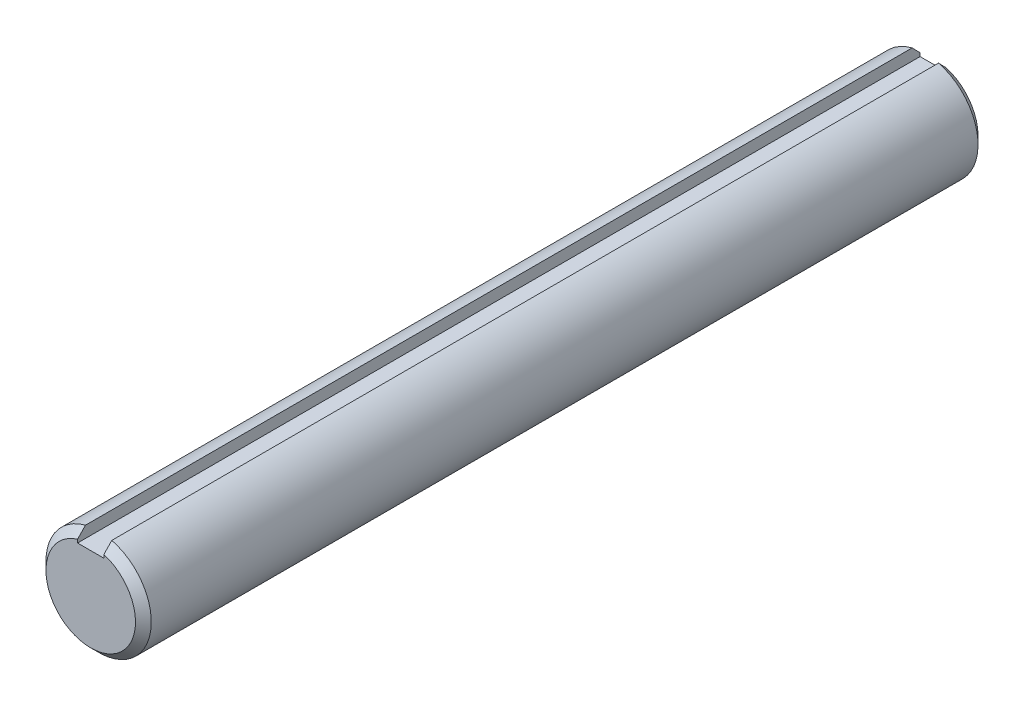
ISO-10303-21;
HEADER;
FILE_DESCRIPTION(('STEP AP214'),'2;1');
FILE_NAME('part.step','',(''),(''),'','','');
FILE_SCHEMA(('AUTOMOTIVE_DESIGN { 1 0 10303 214 1 1 1 1 }'));
ENDSEC;
DATA;
#1=APPLICATION_CONTEXT('core data for automotive mechanical design processes');
#2=APPLICATION_PROTOCOL_DEFINITION('international standard','automotive_design',2000,#1);
#3=PRODUCT_CONTEXT('',#1,'mechanical');
#4=PRODUCT('Part','Part','',(#3));
#5=PRODUCT_RELATED_PRODUCT_CATEGORY('part','',(#4));
#6=PRODUCT_DEFINITION_FORMATION('','',#4);
#7=PRODUCT_DEFINITION_CONTEXT('part definition',#1,'design');
#8=PRODUCT_DEFINITION('design','',#6,#7);
#9=PRODUCT_DEFINITION_SHAPE('','',#8);
#10=(LENGTH_UNIT() NAMED_UNIT(*) SI_UNIT(.MILLI.,.METRE.));
#11=(NAMED_UNIT(*) PLANE_ANGLE_UNIT() SI_UNIT($,.RADIAN.));
#12=(NAMED_UNIT(*) SI_UNIT($,.STERADIAN.) SOLID_ANGLE_UNIT());
#13=UNCERTAINTY_MEASURE_WITH_UNIT(LENGTH_MEASURE(1.E-05),#10,'distance_accuracy_value','');
#14=(GEOMETRIC_REPRESENTATION_CONTEXT(3) GLOBAL_UNCERTAINTY_ASSIGNED_CONTEXT((#13)) GLOBAL_UNIT_ASSIGNED_CONTEXT((#10,
#11,#12)) REPRESENTATION_CONTEXT('',''));
#15=CARTESIAN_POINT('',(0.,0.,0.));
#16=DIRECTION('',(0.,0.,1.));
#17=DIRECTION('',(1.,0.,0.));
#18=AXIS2_PLACEMENT_3D('',#15,#16,#17);
#19=CARTESIAN_POINT('',(0.,0.,38.1));
#20=DIRECTION('',(0.,0.,-1.));
#21=DIRECTION('',(-1.,0.,0.));
#22=AXIS2_PLACEMENT_3D('',#19,#20,#21);
#23=CYLINDRICAL_SURFACE('',#22,4.7625);
#24=CARTESIAN_POINT('',(0.,0.,37.385625));
#25=DIRECTION('',(0.,0.,1.));
#26=DIRECTION('',(1.,0.,0.));
#27=AXIS2_PLACEMENT_3D('',#24,#25,#26);
#28=CIRCLE('',#27,4.7625);
#29=CARTESIAN_POINT('',(1.190625,4.6112707965782,37.385625));
#30=VERTEX_POINT('',#29);
#31=CARTESIAN_POINT('',(-1.190625,4.6112707965782,37.385625));
#32=VERTEX_POINT('',#31);
#33=EDGE_CURVE('E149',#30,#32,#28,.F.);
#34=ORIENTED_EDGE('',*,*,#33,.T.);
#35=DIRECTION('',(0.,0.,-1.));
#36=VECTOR('',#35,1.);
#37=CARTESIAN_POINT('',(-1.190625,4.6112707965782,38.1));
#38=LINE('',#37,#36);
#39=CARTESIAN_POINT('',(-1.190625,4.6112707965782,-37.3856249999999));
#40=VERTEX_POINT('',#39);
#41=EDGE_CURVE('E127',#32,#40,#38,.T.);
#42=ORIENTED_EDGE('',*,*,#41,.T.);
#43=CARTESIAN_POINT('',(0.,0.,-37.3856249999999));
#44=DIRECTION('',(0.,0.,1.));
#45=DIRECTION('',(1.,0.,0.));
#46=AXIS2_PLACEMENT_3D('',#43,#44,#45);
#47=CIRCLE('',#46,4.7625);
#48=CARTESIAN_POINT('',(1.190625,4.6112707965782,-37.3856249999999));
#49=VERTEX_POINT('',#48);
#50=EDGE_CURVE('E146',#40,#49,#47,.T.);
#51=ORIENTED_EDGE('',*,*,#50,.T.);
#52=DIRECTION('',(0.,0.,-1.));
#53=VECTOR('',#52,1.);
#54=CARTESIAN_POINT('',(1.190625,4.6112707965782,38.1));
#55=LINE('',#54,#53);
#56=EDGE_CURVE('E117',#49,#30,#55,.F.);
#57=ORIENTED_EDGE('',*,*,#56,.T.);
#58=EDGE_LOOP('',(#34,#42,#51,#57));
#59=FACE_BOUND('',#58,.T.);
#60=ADVANCED_FACE('F32',(#59),#23,.T.);
#61=CARTESIAN_POINT('',(0.,0.,38.1));
#62=DIRECTION('',(0.,0.,1.));
#63=DIRECTION('',(1.,0.,0.));
#64=AXIS2_PLACEMENT_3D('',#61,#62,#63);
#65=PLANE('',#64);
#66=DIRECTION('',(0.,-1.,0.));
#67=VECTOR('',#66,1.);
#68=CARTESIAN_POINT('',(-1.190625,4.7625,38.1));
#69=LINE('',#68,#67);
#70=CARTESIAN_POINT('',(-1.190625,3.86907329020789,38.1));
#71=VERTEX_POINT('',#70);
#72=CARTESIAN_POINT('',(-1.190625,3.571875,38.1));
#73=VERTEX_POINT('',#72);
#74=EDGE_CURVE('E87',#71,#73,#69,.T.);
#75=ORIENTED_EDGE('',*,*,#74,.F.);
#76=CARTESIAN_POINT('',(0.,0.,38.1));
#77=DIRECTION('',(0.,0.,1.));
#78=DIRECTION('',(1.,0.,0.));
#79=AXIS2_PLACEMENT_3D('',#76,#77,#78);
#80=CIRCLE('',#79,4.04812500000002);
#81=CARTESIAN_POINT('',(1.190625,3.8690732902079,38.1));
#82=VERTEX_POINT('',#81);
#83=EDGE_CURVE('E141',#71,#82,#80,.T.);
#84=ORIENTED_EDGE('',*,*,#83,.T.);
#85=DIRECTION('',(0.,1.,0.));
#86=VECTOR('',#85,1.);
#87=CARTESIAN_POINT('',(1.190625,4.7625,38.1));
#88=LINE('',#87,#86);
#89=CARTESIAN_POINT('',(1.190625,3.571875,38.1));
#90=VERTEX_POINT('',#89);
#91=EDGE_CURVE('E52',#90,#82,#88,.T.);
#92=ORIENTED_EDGE('',*,*,#91,.F.);
#93=DIRECTION('',(1.,0.,0.));
#94=VECTOR('',#93,1.);
#95=CARTESIAN_POINT('',(-1.190625,3.571875,38.1));
#96=LINE('',#95,#94);
#97=EDGE_CURVE('E97',#73,#90,#96,.T.);
#98=ORIENTED_EDGE('',*,*,#97,.F.);
#99=EDGE_LOOP('',(#75,#84,#92,#98));
#100=FACE_BOUND('',#99,.T.);
#101=ADVANCED_FACE('F108',(#100),#65,.T.);
#102=CARTESIAN_POINT('',(0.,0.,-38.1));
#103=DIRECTION('',(0.,0.,1.));
#104=DIRECTION('',(1.,0.,0.));
#105=AXIS2_PLACEMENT_3D('',#102,#103,#104);
#106=PLANE('',#105);
#107=CARTESIAN_POINT('',(0.,0.,-38.1));
#108=DIRECTION('',(0.,0.,1.));
#109=DIRECTION('',(1.,0.,0.));
#110=AXIS2_PLACEMENT_3D('',#107,#108,#109);
#111=CIRCLE('',#110,4.04812499999995);
#112=CARTESIAN_POINT('',(1.190625,3.86907329020782,-38.1));
#113=VERTEX_POINT('',#112);
#114=CARTESIAN_POINT('',(-1.190625,3.86907329020782,-38.1));
#115=VERTEX_POINT('',#114);
#116=EDGE_CURVE('E143',#113,#115,#111,.F.);
#117=ORIENTED_EDGE('',*,*,#116,.T.);
#118=DIRECTION('',(0.,-1.,0.));
#119=VECTOR('',#118,1.);
#120=CARTESIAN_POINT('',(-1.190625,4.7625,-38.1));
#121=LINE('',#120,#119);
#122=CARTESIAN_POINT('',(-1.190625,3.571875,-38.1));
#123=VERTEX_POINT('',#122);
#124=EDGE_CURVE('E110',#115,#123,#121,.T.);
#125=ORIENTED_EDGE('',*,*,#124,.T.);
#126=DIRECTION('',(1.,0.,0.));
#127=VECTOR('',#126,1.);
#128=CARTESIAN_POINT('',(-1.190625,3.571875,-38.1));
#129=LINE('',#128,#127);
#130=CARTESIAN_POINT('',(1.190625,3.571875,-38.1));
#131=VERTEX_POINT('',#130);
#132=EDGE_CURVE('E103',#123,#131,#129,.T.);
#133=ORIENTED_EDGE('',*,*,#132,.T.);
#134=DIRECTION('',(0.,1.,0.));
#135=VECTOR('',#134,1.);
#136=CARTESIAN_POINT('',(1.190625,4.7625,-38.1));
#137=LINE('',#136,#135);
#138=EDGE_CURVE('E106',#131,#113,#137,.T.);
#139=ORIENTED_EDGE('',*,*,#138,.T.);
#140=EDGE_LOOP('',(#117,#125,#133,#139));
#141=FACE_BOUND('',#140,.T.);
#142=ADVANCED_FACE('F160',(#141),#106,.F.);
#143=CARTESIAN_POINT('',(0.,0.,-37.3856249999999));
#144=DIRECTION('',(0.,0.,1.));
#145=DIRECTION('',(1.,0.,0.));
#146=AXIS2_PLACEMENT_3D('',#143,#144,#145);
#147=CONICAL_SURFACE('',#146,4.7625,0.785398163397442);
#148=CARTESIAN_POINT('',(-1.190625,1.87850097271221,-39.9240850284379));
#149=CARTESIAN_POINT('',(-1.190625,1.96496299884481,-39.8510073058042));
#150=CARTESIAN_POINT('',(-1.190625,2.0507562741666,-39.7771497885816));
#151=CARTESIAN_POINT('',(-1.190625,2.22127861635865,-39.6282277260678));
#152=CARTESIAN_POINT('',(-1.190625,2.30600776399307,-39.5531632733778));
#153=CARTESIAN_POINT('',(-1.190625,2.47467321596084,-39.4021821040469));
#154=CARTESIAN_POINT('',(-1.190625,2.55860965904958,-39.3262655418491));
#155=CARTESIAN_POINT('',(-1.190625,2.72587735731294,-39.1737654674885));
#156=CARTESIAN_POINT('',(-1.190625,2.80920859911518,-39.0971819406703));
#157=CARTESIAN_POINT('',(-1.190625,3.05845317219209,-38.8667083706051));
#158=CARTESIAN_POINT('',(-1.190625,3.22366100260703,-38.7120559541042));
#159=CARTESIAN_POINT('',(-1.190625,3.55286851056946,-38.4014575350039));
#160=CARTESIAN_POINT('',(-1.190625,3.71686812391967,-38.2455114645904));
#161=CARTESIAN_POINT('',(-1.190625,4.04398231118588,-37.9327861434969));
#162=CARTESIAN_POINT('',(-1.190625,4.20709712062187,-37.7760071389913));
#163=CARTESIAN_POINT('',(-1.190625,4.53272337793493,-37.4618316367084));
#164=CARTESIAN_POINT('',(-1.190625,4.69523483914637,-37.3044351527377));
#165=CARTESIAN_POINT('',(-1.190625,5.01985083958832,-36.9891531362509));
#166=CARTESIAN_POINT('',(-1.190625,5.1819552830442,-36.8312675051814));
#167=CARTESIAN_POINT('',(-1.190625,5.50582146061236,-36.5151458163815));
#168=CARTESIAN_POINT('',(-1.190625,5.66758319552055,-36.3569097594666));
#169=CARTESIAN_POINT('',(-1.190625,5.82922373270554,-36.1985504591977));
#170=B_SPLINE_CURVE_WITH_KNOTS('',3,(#148,#149,#150,#151,#152,#153,#154,#155,#156,#157,#158,
#159,#160,#161,#162,#163,#164,#165,#166,#167,#168,#169),.UNSPECIFIED.,.F.,.F.,(4,2,2,2,2,2,2,2,
2,2,4),(0.,0.339608565966453,0.679191198958351,1.01871324650252,1.35824277335593,
2.03712546494009,2.71604397174741,3.39477189640468,4.07348473037601,4.75234458922043,
5.43120286977254),.UNSPECIFIED.);
#171=EDGE_CURVE('E60',#115,#40,#170,.T.);
#172=ORIENTED_EDGE('',*,*,#171,.F.);
#173=ORIENTED_EDGE('',*,*,#116,.F.);
#174=CARTESIAN_POINT('',(1.190625,5.82922373270554,-36.1985504591977));
#175=CARTESIAN_POINT('',(1.190625,5.66758319552055,-36.3569097594666));
#176=CARTESIAN_POINT('',(1.190625,5.50582146061236,-36.5151458163815));
#177=CARTESIAN_POINT('',(1.190625,5.18195528304419,-36.8312675051814));
#178=CARTESIAN_POINT('',(1.190625,5.01985083958832,-36.9891531362509));
#179=CARTESIAN_POINT('',(1.190625,4.69523483914636,-37.3044351527377));
#180=CARTESIAN_POINT('',(1.190625,4.53272337793492,-37.4618316367084));
#181=CARTESIAN_POINT('',(1.190625,4.20709712062186,-37.7760071389913));
#182=CARTESIAN_POINT('',(1.190625,4.04398231118588,-37.9327861434969));
#183=CARTESIAN_POINT('',(1.190625,3.71686812391967,-38.2455114645904));
#184=CARTESIAN_POINT('',(1.190625,3.55286851056946,-38.4014575350039));
#185=CARTESIAN_POINT('',(1.190625,3.22366100260703,-38.7120559541042));
#186=CARTESIAN_POINT('',(1.190625,3.05845317219209,-38.8667083706051));
#187=CARTESIAN_POINT('',(1.190625,2.80920859911518,-39.0971819406703));
#188=CARTESIAN_POINT('',(1.190625,2.72587735731294,-39.1737654674885));
#189=CARTESIAN_POINT('',(1.190625,2.55860965904958,-39.3262655418491));
#190=CARTESIAN_POINT('',(1.190625,2.47467321596084,-39.4021821040469));
#191=CARTESIAN_POINT('',(1.190625,2.30600776399307,-39.5531632733778));
#192=CARTESIAN_POINT('',(1.190625,2.22127861635865,-39.6282277260678));
#193=CARTESIAN_POINT('',(1.190625,2.0507562741666,-39.7771497885816));
#194=CARTESIAN_POINT('',(1.190625,1.96496299884481,-39.8510073058042));
#195=CARTESIAN_POINT('',(1.190625,1.87850097271221,-39.9240850284379));
#196=B_SPLINE_CURVE_WITH_KNOTS('',3,(#174,#175,#176,#177,#178,#179,#180,#181,#182,#183,#184,
#185,#186,#187,#188,#189,#190,#191,#192,#193,#194,#195),.UNSPECIFIED.,.F.,.F.,(4,2,2,2,2,2,2,2,
2,2,4),(0.,0.678858280552111,1.35771813939654,2.03643097336787,2.71515889802513,
3.39407740483245,4.07296009641661,4.41248962327002,4.75201167081419,5.09159430380609,
5.43120286977254),.UNSPECIFIED.);
#197=EDGE_CURVE('E121',#49,#113,#196,.T.);
#198=ORIENTED_EDGE('',*,*,#197,.F.);
#199=ORIENTED_EDGE('',*,*,#50,.F.);
#200=EDGE_LOOP('',(#172,#173,#198,#199));
#201=FACE_BOUND('',#200,.T.);
#202=ADVANCED_FACE('F129',(#201),#147,.T.);
#203=CARTESIAN_POINT('',(0.,0.,38.1));
#204=DIRECTION('',(0.,0.,-1.));
#205=DIRECTION('',(-1.,0.,0.));
#206=AXIS2_PLACEMENT_3D('',#203,#204,#205);
#207=CONICAL_SURFACE('',#206,4.04812500000002,0.785398163397447);
#208=CARTESIAN_POINT('',(-1.190625,5.82922373270553,36.1985504591978));
#209=CARTESIAN_POINT('',(-1.190625,5.66758319552054,36.3569097594667));
#210=CARTESIAN_POINT('',(-1.190625,5.50582146061236,36.5151458163816));
#211=CARTESIAN_POINT('',(-1.190625,5.1819552830442,36.8312675051815));
#212=CARTESIAN_POINT('',(-1.190625,5.01985083958833,36.989153136251));
#213=CARTESIAN_POINT('',(-1.190625,4.69523483914638,37.3044351527378));
#214=CARTESIAN_POINT('',(-1.190625,4.53272337793493,37.4618316367084));
#215=CARTESIAN_POINT('',(-1.190625,4.20709712062188,37.7760071389914));
#216=CARTESIAN_POINT('',(-1.190625,4.04398231118589,37.932786143497));
#217=CARTESIAN_POINT('',(-1.190625,3.71686812391969,38.2455114645904));
#218=CARTESIAN_POINT('',(-1.190625,3.55286851056948,38.4014575350039));
#219=CARTESIAN_POINT('',(-1.190625,3.22366100260706,38.7120559541042));
#220=CARTESIAN_POINT('',(-1.190625,3.05845317219213,38.8667083706051));
#221=CARTESIAN_POINT('',(-1.190625,2.80920859911521,39.0971819406704));
#222=CARTESIAN_POINT('',(-1.190625,2.72587735731297,39.1737654674886));
#223=CARTESIAN_POINT('',(-1.190625,2.55860965904962,39.3262655418491));
#224=CARTESIAN_POINT('',(-1.190625,2.47467321596089,39.4021821040469));
#225=CARTESIAN_POINT('',(-1.190625,2.30600776399311,39.5531632733778));
#226=CARTESIAN_POINT('',(-1.190625,2.22127861635869,39.6282277260679));
#227=CARTESIAN_POINT('',(-1.190625,2.05075627416664,39.7771497885816));
#228=CARTESIAN_POINT('',(-1.190625,1.96496299884486,39.8510073058043));
#229=CARTESIAN_POINT('',(-1.190625,1.87850097271226,39.9240850284379));
#230=B_SPLINE_CURVE_WITH_KNOTS('',3,(#208,#209,#210,#211,#212,#213,#214,#215,#216,#217,#218,
#219,#220,#221,#222,#223,#224,#225,#226,#227,#228,#229),.UNSPECIFIED.,.F.,.F.,(4,2,2,2,2,2,2,2,
2,2,4),(0.,0.678858280552101,1.35771813939651,2.03643097336783,2.71515889802508,
3.39407740483239,4.07296009641654,4.41248962326994,4.75201167081411,5.091594303806,
5.43120286977245),.UNSPECIFIED.);
#231=EDGE_CURVE('E11',#32,#71,#230,.T.);
#232=ORIENTED_EDGE('',*,*,#231,.F.);
#233=ORIENTED_EDGE('',*,*,#33,.F.);
#234=CARTESIAN_POINT('',(1.190625,1.87850097271226,39.9240850284379));
#235=CARTESIAN_POINT('',(1.190625,1.96496299884486,39.8510073058043));
#236=CARTESIAN_POINT('',(1.190625,2.05075627416664,39.7771497885816));
#237=CARTESIAN_POINT('',(1.190625,2.22127861635869,39.6282277260679));
#238=CARTESIAN_POINT('',(1.190625,2.30600776399311,39.5531632733778));
#239=CARTESIAN_POINT('',(1.190625,2.47467321596089,39.4021821040469));
#240=CARTESIAN_POINT('',(1.190625,2.55860965904963,39.3262655418491));
#241=CARTESIAN_POINT('',(1.190625,2.72587735731298,39.1737654674886));
#242=CARTESIAN_POINT('',(1.190625,2.80920859911522,39.0971819406704));
#243=CARTESIAN_POINT('',(1.190625,3.05845317219213,38.8667083706051));
#244=CARTESIAN_POINT('',(1.190625,3.22366100260706,38.7120559541042));
#245=CARTESIAN_POINT('',(1.190625,3.55286851056948,38.4014575350039));
#246=CARTESIAN_POINT('',(1.190625,3.71686812391969,38.2455114645904));
#247=CARTESIAN_POINT('',(1.190625,4.0439823111859,37.932786143497));
#248=CARTESIAN_POINT('',(1.190625,4.20709712062188,37.7760071389914));
#249=CARTESIAN_POINT('',(1.190625,4.53272337793493,37.4618316367084));
#250=CARTESIAN_POINT('',(1.190625,4.69523483914638,37.3044351527378));
#251=CARTESIAN_POINT('',(1.190625,5.01985083958833,36.989153136251));
#252=CARTESIAN_POINT('',(1.190625,5.1819552830442,36.8312675051815));
#253=CARTESIAN_POINT('',(1.190625,5.50582146061236,36.5151458163816));
#254=CARTESIAN_POINT('',(1.190625,5.66758319552054,36.3569097594667));
#255=CARTESIAN_POINT('',(1.190625,5.82922373270553,36.1985504591978));
#256=B_SPLINE_CURVE_WITH_KNOTS('',3,(#234,#235,#236,#237,#238,#239,#240,#241,#242,#243,#244,
#245,#246,#247,#248,#249,#250,#251,#252,#253,#254,#255),.UNSPECIFIED.,.F.,.F.,(4,2,2,2,2,2,2,2,
2,2,4),(0.,0.339608565966453,0.679191198958346,1.01871324650252,1.35824277335591,
2.03712546494007,2.71604397174737,3.39477189640462,4.07348473037594,4.75234458922035,
5.43120286977245),.UNSPECIFIED.);
#257=EDGE_CURVE('E45',#82,#30,#256,.T.);
#258=ORIENTED_EDGE('',*,*,#257,.F.);
#259=ORIENTED_EDGE('',*,*,#83,.F.);
#260=EDGE_LOOP('',(#232,#233,#258,#259));
#261=FACE_BOUND('',#260,.T.);
#262=ADVANCED_FACE('F34',(#261),#207,.T.);
#263=CARTESIAN_POINT('',(-1.190625,4.7625,-38.1));
#264=DIRECTION('',(-1.,0.,0.));
#265=DIRECTION('',(0.,-1.,0.));
#266=AXIS2_PLACEMENT_3D('',#263,#264,#265);
#267=PLANE('',#266);
#268=ORIENTED_EDGE('',*,*,#171,.T.);
#269=ORIENTED_EDGE('',*,*,#41,.F.);
#270=ORIENTED_EDGE('',*,*,#231,.T.);
#271=ORIENTED_EDGE('',*,*,#74,.T.);
#272=DIRECTION('',(0.,0.,1.));
#273=VECTOR('',#272,1.);
#274=CARTESIAN_POINT('',(-1.190625,3.571875,-38.1));
#275=LINE('',#274,#273);
#276=EDGE_CURVE('E90',#123,#73,#275,.T.);
#277=ORIENTED_EDGE('',*,*,#276,.F.);
#278=ORIENTED_EDGE('',*,*,#124,.F.);
#279=EDGE_LOOP('',(#268,#269,#270,#271,#277,#278));
#280=FACE_BOUND('',#279,.T.);
#281=ADVANCED_FACE('F89',(#280),#267,.F.);
#282=CARTESIAN_POINT('',(1.190625,4.7625,-38.1));
#283=DIRECTION('',(1.,0.,0.));
#284=DIRECTION('',(0.,1.,0.));
#285=AXIS2_PLACEMENT_3D('',#282,#283,#284);
#286=PLANE('',#285);
#287=ORIENTED_EDGE('',*,*,#197,.T.);
#288=ORIENTED_EDGE('',*,*,#138,.F.);
#289=DIRECTION('',(0.,0.,1.));
#290=VECTOR('',#289,1.);
#291=CARTESIAN_POINT('',(1.190625,3.571875,-38.1));
#292=LINE('',#291,#290);
#293=EDGE_CURVE('E105',#131,#90,#292,.T.);
#294=ORIENTED_EDGE('',*,*,#293,.T.);
#295=ORIENTED_EDGE('',*,*,#91,.T.);
#296=ORIENTED_EDGE('',*,*,#257,.T.);
#297=ORIENTED_EDGE('',*,*,#56,.F.);
#298=EDGE_LOOP('',(#287,#288,#294,#295,#296,#297));
#299=FACE_BOUND('',#298,.T.);
#300=ADVANCED_FACE('F132',(#299),#286,.F.);
#301=CARTESIAN_POINT('',(-1.190625,3.571875,-38.1));
#302=DIRECTION('',(0.,-1.,0.));
#303=DIRECTION('',(0.,0.,-1.));
#304=AXIS2_PLACEMENT_3D('',#301,#302,#303);
#305=PLANE('',#304);
#306=ORIENTED_EDGE('',*,*,#293,.F.);
#307=ORIENTED_EDGE('',*,*,#132,.F.);
#308=ORIENTED_EDGE('',*,*,#276,.T.);
#309=ORIENTED_EDGE('',*,*,#97,.T.);
#310=EDGE_LOOP('',(#306,#307,#308,#309));
#311=FACE_BOUND('',#310,.T.);
#312=ADVANCED_FACE('F101',(#311),#305,.F.);
#313=CLOSED_SHELL('',(#60,#101,#142,#202,#262,#281,#300,#312));
#314=MANIFOLD_SOLID_BREP('B2',#313);
#315=ADVANCED_BREP_SHAPE_REPRESENTATION('',(#18,#314),#14);
#316=SHAPE_DEFINITION_REPRESENTATION(#9,#315);
ENDSEC;
END-ISO-10303-21;
